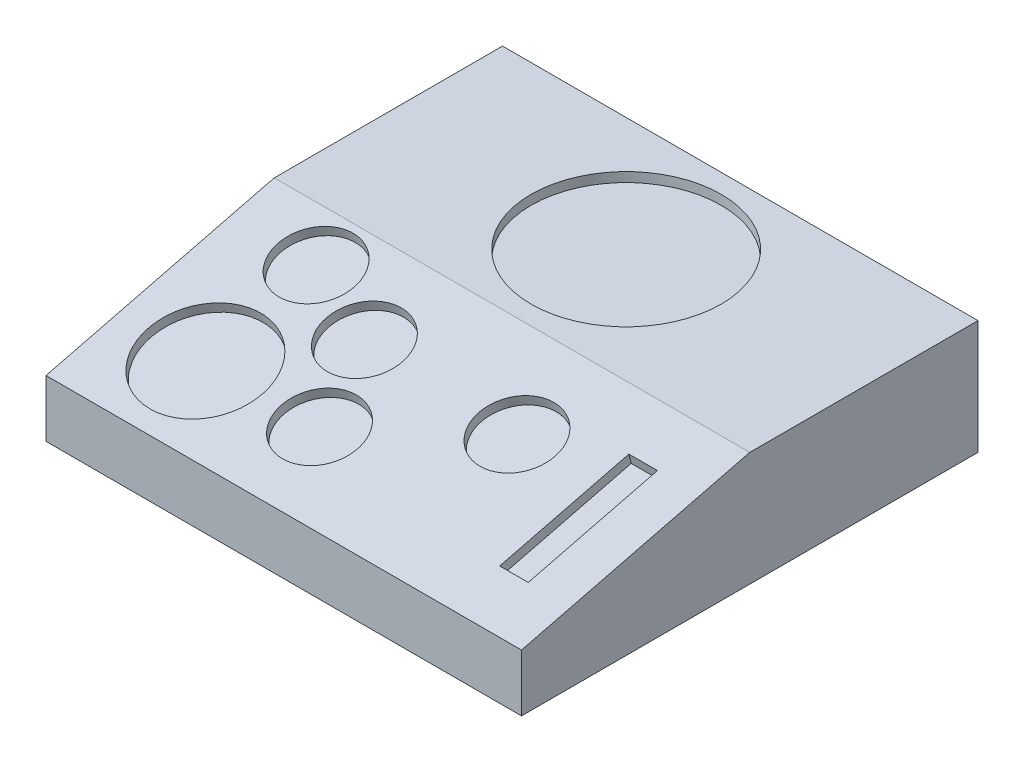
ISO-10303-21;
HEADER;
FILE_DESCRIPTION(('STEP AP214'),'2;1');
FILE_NAME('part.step','',(''),(''),'','','');
FILE_SCHEMA(('AUTOMOTIVE_DESIGN { 1 0 10303 214 1 1 1 1 }'));
ENDSEC;
DATA;
#1=APPLICATION_CONTEXT('core data for automotive mechanical design processes');
#2=APPLICATION_PROTOCOL_DEFINITION('international standard','automotive_design',2000,#1);
#3=PRODUCT_CONTEXT('',#1,'mechanical');
#4=PRODUCT('Part','Part','',(#3));
#5=PRODUCT_RELATED_PRODUCT_CATEGORY('part','',(#4));
#6=PRODUCT_DEFINITION_FORMATION('','',#4);
#7=PRODUCT_DEFINITION_CONTEXT('part definition',#1,'design');
#8=PRODUCT_DEFINITION('design','',#6,#7);
#9=PRODUCT_DEFINITION_SHAPE('','',#8);
#10=(LENGTH_UNIT() NAMED_UNIT(*) SI_UNIT(.MILLI.,.METRE.));
#11=(NAMED_UNIT(*) PLANE_ANGLE_UNIT() SI_UNIT($,.RADIAN.));
#12=(NAMED_UNIT(*) SI_UNIT($,.STERADIAN.) SOLID_ANGLE_UNIT());
#13=UNCERTAINTY_MEASURE_WITH_UNIT(LENGTH_MEASURE(1.E-05),#10,'distance_accuracy_value','');
#14=(GEOMETRIC_REPRESENTATION_CONTEXT(3) GLOBAL_UNCERTAINTY_ASSIGNED_CONTEXT((#13)) GLOBAL_UNIT_ASSIGNED_CONTEXT((#10,
#11,#12)) REPRESENTATION_CONTEXT('',''));
#15=CARTESIAN_POINT('',(0.,0.,0.));
#16=DIRECTION('',(0.,0.,1.));
#17=DIRECTION('',(1.,0.,0.));
#18=AXIS2_PLACEMENT_3D('',#15,#16,#17);
#19=CARTESIAN_POINT('',(125.,60.,60.));
#20=DIRECTION('',(-1.,0.,0.));
#21=DIRECTION('',(0.,0.,1.));
#22=AXIS2_PLACEMENT_3D('',#19,#20,#21);
#23=PLANE('',#22);
#24=DIRECTION('',(0.,0.,-1.));
#25=VECTOR('',#24,1.);
#26=CARTESIAN_POINT('',(125.,0.,60.));
#27=LINE('',#26,#25);
#28=CARTESIAN_POINT('',(125.,0.,180.));
#29=VERTEX_POINT('',#28);
#30=CARTESIAN_POINT('',(125.,0.,-60.));
#31=VERTEX_POINT('',#30);
#32=EDGE_CURVE('E190',#29,#31,#27,.T.);
#33=ORIENTED_EDGE('',*,*,#32,.T.);
#34=DIRECTION('',(0.,-1.,0.));
#35=VECTOR('',#34,1.);
#36=CARTESIAN_POINT('',(125.,60.,-60.));
#37=LINE('',#36,#35);
#38=CARTESIAN_POINT('',(125.,60.,-60.));
#39=VERTEX_POINT('',#38);
#40=EDGE_CURVE('E11',#39,#31,#37,.T.);
#41=ORIENTED_EDGE('',*,*,#40,.F.);
#42=DIRECTION('',(0.,0.,-1.));
#43=VECTOR('',#42,1.);
#44=CARTESIAN_POINT('',(125.,60.,60.));
#45=LINE('',#44,#43);
#46=CARTESIAN_POINT('',(125.,60.,60.));
#47=VERTEX_POINT('',#46);
#48=EDGE_CURVE('E200',#47,#39,#45,.T.);
#49=ORIENTED_EDGE('',*,*,#48,.F.);
#50=DIRECTION('',(0.,-0.242535625036333,0.970142500145332));
#51=VECTOR('',#50,1.);
#52=CARTESIAN_POINT('',(125.,30.,180.));
#53=LINE('',#52,#51);
#54=CARTESIAN_POINT('',(125.,30.,180.));
#55=VERTEX_POINT('',#54);
#56=EDGE_CURVE('E187',#47,#55,#53,.T.);
#57=ORIENTED_EDGE('',*,*,#56,.T.);
#58=DIRECTION('',(0.,-1.,0.));
#59=VECTOR('',#58,1.);
#60=CARTESIAN_POINT('',(125.,0.,180.));
#61=LINE('',#60,#59);
#62=EDGE_CURVE('E184',#55,#29,#61,.T.);
#63=ORIENTED_EDGE('',*,*,#62,.T.);
#64=EDGE_LOOP('',(#33,#41,#49,#57,#63));
#65=FACE_BOUND('',#64,.T.);
#66=ADVANCED_FACE('F33',(#65),#23,.F.);
#67=CARTESIAN_POINT('',(-125.,60.,-60.));
#68=DIRECTION('',(0.,0.,1.));
#69=DIRECTION('',(1.,0.,0.));
#70=AXIS2_PLACEMENT_3D('',#67,#68,#69);
#71=PLANE('',#70);
#72=DIRECTION('',(-1.,0.,0.));
#73=VECTOR('',#72,1.);
#74=CARTESIAN_POINT('',(-125.,0.,-60.));
#75=LINE('',#74,#73);
#76=CARTESIAN_POINT('',(-125.,0.,-60.));
#77=VERTEX_POINT('',#76);
#78=EDGE_CURVE('E70',#31,#77,#75,.T.);
#79=ORIENTED_EDGE('',*,*,#78,.T.);
#80=DIRECTION('',(0.,-1.,0.));
#81=VECTOR('',#80,1.);
#82=CARTESIAN_POINT('',(-125.,60.,-60.));
#83=LINE('',#82,#81);
#84=CARTESIAN_POINT('',(-125.,60.,-60.));
#85=VERTEX_POINT('',#84);
#86=EDGE_CURVE('E40',#85,#77,#83,.T.);
#87=ORIENTED_EDGE('',*,*,#86,.F.);
#88=DIRECTION('',(-1.,0.,0.));
#89=VECTOR('',#88,1.);
#90=CARTESIAN_POINT('',(-125.,60.,-60.));
#91=LINE('',#90,#89);
#92=EDGE_CURVE('E75',#39,#85,#91,.T.);
#93=ORIENTED_EDGE('',*,*,#92,.F.);
#94=ORIENTED_EDGE('',*,*,#40,.T.);
#95=EDGE_LOOP('',(#79,#87,#93,#94));
#96=FACE_BOUND('',#95,.T.);
#97=ADVANCED_FACE('F237',(#96),#71,.F.);
#98=CARTESIAN_POINT('',(-125.,60.,60.));
#99=DIRECTION('',(1.,0.,0.));
#100=DIRECTION('',(0.,0.,-1.));
#101=AXIS2_PLACEMENT_3D('',#98,#99,#100);
#102=PLANE('',#101);
#103=DIRECTION('',(0.,0.,1.));
#104=VECTOR('',#103,1.);
#105=CARTESIAN_POINT('',(-125.,0.,60.));
#106=LINE('',#105,#104);
#107=CARTESIAN_POINT('',(-125.,0.,180.));
#108=VERTEX_POINT('',#107);
#109=EDGE_CURVE('E202',#77,#108,#106,.T.);
#110=ORIENTED_EDGE('',*,*,#109,.T.);
#111=DIRECTION('',(0.,1.,0.));
#112=VECTOR('',#111,1.);
#113=CARTESIAN_POINT('',(-125.,0.,180.));
#114=LINE('',#113,#112);
#115=CARTESIAN_POINT('',(-125.,30.,180.));
#116=VERTEX_POINT('',#115);
#117=EDGE_CURVE('E193',#108,#116,#114,.T.);
#118=ORIENTED_EDGE('',*,*,#117,.T.);
#119=DIRECTION('',(0.,0.242535625036333,-0.970142500145332));
#120=VECTOR('',#119,1.);
#121=CARTESIAN_POINT('',(-125.,30.,180.));
#122=LINE('',#121,#120);
#123=CARTESIAN_POINT('',(-125.,60.,60.));
#124=VERTEX_POINT('',#123);
#125=EDGE_CURVE('E181',#116,#124,#122,.T.);
#126=ORIENTED_EDGE('',*,*,#125,.T.);
#127=DIRECTION('',(0.,0.,1.));
#128=VECTOR('',#127,1.);
#129=CARTESIAN_POINT('',(-125.,60.,60.));
#130=LINE('',#129,#128);
#131=EDGE_CURVE('E204',#85,#124,#130,.T.);
#132=ORIENTED_EDGE('',*,*,#131,.F.);
#133=ORIENTED_EDGE('',*,*,#86,.T.);
#134=EDGE_LOOP('',(#110,#118,#126,#132,#133));
#135=FACE_BOUND('',#134,.T.);
#136=ADVANCED_FACE('F213',(#135),#102,.F.);
#137=CARTESIAN_POINT('',(125.,60.,-60.));
#138=DIRECTION('',(0.,-1.,0.));
#139=DIRECTION('',(0.,0.,-1.));
#140=AXIS2_PLACEMENT_3D('',#137,#138,#139);
#141=PLANE('',#140);
#142=CARTESIAN_POINT('',(0.,60.,0.));
#143=DIRECTION('',(0.,1.,0.));
#144=DIRECTION('',(0.,0.,1.));
#145=AXIS2_PLACEMENT_3D('',#142,#143,#144);
#146=CIRCLE('',#145,50.);
#147=CARTESIAN_POINT('',(0.,60.,50.));
#148=VERTEX_POINT('',#147);
#149=EDGE_CURVE('E175',#148,#148,#146,.T.);
#150=ORIENTED_EDGE('',*,*,#149,.F.);
#151=EDGE_LOOP('',(#150));
#152=FACE_BOUND('',#151,.T.);
#153=ORIENTED_EDGE('',*,*,#48,.T.);
#154=ORIENTED_EDGE('',*,*,#92,.T.);
#155=ORIENTED_EDGE('',*,*,#131,.T.);
#156=DIRECTION('',(1.,0.,0.));
#157=VECTOR('',#156,1.);
#158=CARTESIAN_POINT('',(-125.,60.,60.));
#159=LINE('',#158,#157);
#160=EDGE_CURVE('E56',#124,#47,#159,.T.);
#161=ORIENTED_EDGE('',*,*,#160,.T.);
#162=EDGE_LOOP('',(#153,#154,#155,#161));
#163=FACE_BOUND('',#162,.T.);
#164=ADVANCED_FACE('F228',(#152,#163),#141,.F.);
#165=CARTESIAN_POINT('',(125.,0.,-60.));
#166=DIRECTION('',(0.,-1.,0.));
#167=DIRECTION('',(0.,0.,-1.));
#168=AXIS2_PLACEMENT_3D('',#165,#166,#167);
#169=PLANE('',#168);
#170=ORIENTED_EDGE('',*,*,#32,.F.);
#171=DIRECTION('',(-1.,0.,0.));
#172=VECTOR('',#171,1.);
#173=CARTESIAN_POINT('',(259.164078649987,0.,180.));
#174=LINE('',#173,#172);
#175=EDGE_CURVE('E196',#29,#108,#174,.T.);
#176=ORIENTED_EDGE('',*,*,#175,.T.);
#177=ORIENTED_EDGE('',*,*,#109,.F.);
#178=ORIENTED_EDGE('',*,*,#78,.F.);
#179=EDGE_LOOP('',(#170,#176,#177,#178));
#180=FACE_BOUND('',#179,.T.);
#181=ADVANCED_FACE('F215',(#180),#169,.T.);
#182=CARTESIAN_POINT('',(259.164078649987,30.,180.));
#183=DIRECTION('',(0.,0.970142500145332,0.242535625036333));
#184=DIRECTION('',(0.,-0.242535625036333,0.970142500145332));
#185=AXIS2_PLACEMENT_3D('',#182,#183,#184);
#186=PLANE('',#185);
#187=DIRECTION('',(0.,-0.242535625036333,0.970142500145332));
#188=VECTOR('',#187,1.);
#189=CARTESIAN_POINT('',(87.5,53.4887468762717,86.0450124949134));
#190=LINE('',#189,#188);
#191=CARTESIAN_POINT('',(87.5,53.4887468762717,86.0450124949134));
#192=VERTEX_POINT('',#191);
#193=CARTESIAN_POINT('',(87.5,36.5112531237283,153.954987505087));
#194=VERTEX_POINT('',#193);
#195=EDGE_CURVE('E47',#192,#194,#190,.T.);
#196=ORIENTED_EDGE('',*,*,#195,.F.);
#197=DIRECTION('',(-1.,0.,0.));
#198=VECTOR('',#197,1.);
#199=CARTESIAN_POINT('',(102.5,53.4887468762717,86.0450124949134));
#200=LINE('',#199,#198);
#201=CARTESIAN_POINT('',(102.5,53.4887468762717,86.0450124949134));
#202=VERTEX_POINT('',#201);
#203=EDGE_CURVE('E129',#202,#192,#200,.T.);
#204=ORIENTED_EDGE('',*,*,#203,.F.);
#205=DIRECTION('',(0.,0.242535625036333,-0.970142500145332));
#206=VECTOR('',#205,1.);
#207=CARTESIAN_POINT('',(102.5,53.4887468762717,86.0450124949134));
#208=LINE('',#207,#206);
#209=CARTESIAN_POINT('',(102.5,36.5112531237284,153.954987505087));
#210=VERTEX_POINT('',#209);
#211=EDGE_CURVE('E132',#210,#202,#208,.T.);
#212=ORIENTED_EDGE('',*,*,#211,.F.);
#213=DIRECTION('',(1.,0.,0.));
#214=VECTOR('',#213,1.);
#215=CARTESIAN_POINT('',(102.5,36.5112531237284,153.954987505087));
#216=LINE('',#215,#214);
#217=EDGE_CURVE('E138',#194,#210,#216,.T.);
#218=ORIENTED_EDGE('',*,*,#217,.F.);
#219=EDGE_LOOP('',(#196,#204,#212,#218));
#220=FACE_BOUND('',#219,.T.);
#221=CARTESIAN_POINT('',(45.,49.4028500029067,102.388599988373));
#222=DIRECTION('',(0.,0.970142500145332,0.242535625036333));
#223=DIRECTION('',(0.,-0.242535625036333,0.970142500145332));
#224=AXIS2_PLACEMENT_3D('',#221,#222,#223);
#225=CIRCLE('',#224,20.);
#226=CARTESIAN_POINT('',(45.,44.55213750218,121.79144999128));
#227=VERTEX_POINT('',#226);
#228=EDGE_CURVE('E144',#227,#227,#225,.T.);
#229=ORIENTED_EDGE('',*,*,#228,.F.);
#230=EDGE_LOOP('',(#229));
#231=FACE_BOUND('',#230,.T.);
#232=CARTESIAN_POINT('',(-20.,39.7014250014533,141.194299994187));
#233=DIRECTION('',(0.,0.970142500145332,0.242535625036333));
#234=DIRECTION('',(0.,-0.242535625036333,0.970142500145332));
#235=AXIS2_PLACEMENT_3D('',#232,#233,#234);
#236=CIRCLE('',#235,20.);
#237=CARTESIAN_POINT('',(-20.,34.8507125007267,160.597149997093));
#238=VERTEX_POINT('',#237);
#239=EDGE_CURVE('E151',#238,#238,#236,.T.);
#240=ORIENTED_EDGE('',*,*,#239,.F.);
#241=EDGE_LOOP('',(#240));
#242=FACE_BOUND('',#241,.T.);
#243=CARTESIAN_POINT('',(-37.573593128807,49.9913401100038,100.034639559985));
#244=DIRECTION('',(0.,0.970142500145332,0.242535625036333));
#245=DIRECTION('',(0.,-0.242535625036333,0.970142500145332));
#246=AXIS2_PLACEMENT_3D('',#243,#244,#245);
#247=CIRCLE('',#246,20.);
#248=CARTESIAN_POINT('',(-37.573593128807,45.1406276092772,119.437489562891));
#249=VERTEX_POINT('',#248);
#250=EDGE_CURVE('E157',#249,#249,#247,.T.);
#251=ORIENTED_EDGE('',*,*,#250,.F.);
#252=EDGE_LOOP('',(#251));
#253=FACE_BOUND('',#252,.T.);
#254=CARTESIAN_POINT('',(-80.,54.2535625036333,82.9857499854668));
#255=DIRECTION('',(0.,0.970142500145332,0.242535625036333));
#256=DIRECTION('',(0.,-0.242535625036333,0.970142500145332));
#257=AXIS2_PLACEMENT_3D('',#254,#255,#256);
#258=CIRCLE('',#257,20.);
#259=CARTESIAN_POINT('',(-80.,49.4028500029067,102.388599988373));
#260=VERTEX_POINT('',#259);
#261=EDGE_CURVE('E163',#260,#260,#258,.T.);
#262=ORIENTED_EDGE('',*,*,#261,.F.);
#263=EDGE_LOOP('',(#262));
#264=FACE_BOUND('',#263,.T.);
#265=CARTESIAN_POINT('',(-80.,39.7014250014533,141.194299994187));
#266=DIRECTION('',(0.,0.970142500145332,0.242535625036333));
#267=DIRECTION('',(0.,-0.242535625036333,0.970142500145332));
#268=AXIS2_PLACEMENT_3D('',#265,#266,#267);
#269=CIRCLE('',#268,30.);
#270=CARTESIAN_POINT('',(-80.,32.4253562503633,170.298574998547));
#271=VERTEX_POINT('',#270);
#272=EDGE_CURVE('E169',#271,#271,#269,.T.);
#273=ORIENTED_EDGE('',*,*,#272,.F.);
#274=EDGE_LOOP('',(#273));
#275=FACE_BOUND('',#274,.T.);
#276=ORIENTED_EDGE('',*,*,#56,.F.);
#277=ORIENTED_EDGE('',*,*,#160,.F.);
#278=ORIENTED_EDGE('',*,*,#125,.F.);
#279=DIRECTION('',(-1.,0.,0.));
#280=VECTOR('',#279,1.);
#281=CARTESIAN_POINT('',(259.164078649987,30.,180.));
#282=LINE('',#281,#280);
#283=EDGE_CURVE('E188',#55,#116,#282,.T.);
#284=ORIENTED_EDGE('',*,*,#283,.F.);
#285=EDGE_LOOP('',(#276,#277,#278,#284));
#286=FACE_BOUND('',#285,.T.);
#287=ADVANCED_FACE('F225',(#220,#231,#242,#253,#264,#275,#286),#186,.T.);
#288=CARTESIAN_POINT('',(259.164078649987,0.,180.));
#289=DIRECTION('',(0.,0.,1.));
#290=DIRECTION('',(1.,0.,0.));
#291=AXIS2_PLACEMENT_3D('',#288,#289,#290);
#292=PLANE('',#291);
#293=ORIENTED_EDGE('',*,*,#62,.F.);
#294=ORIENTED_EDGE('',*,*,#283,.T.);
#295=ORIENTED_EDGE('',*,*,#117,.F.);
#296=ORIENTED_EDGE('',*,*,#175,.F.);
#297=EDGE_LOOP('',(#293,#294,#295,#296));
#298=FACE_BOUND('',#297,.T.);
#299=ADVANCED_FACE('F220',(#298),#292,.T.);
#300=CARTESIAN_POINT('',(0.,55.,0.));
#301=DIRECTION('',(0.,1.,0.));
#302=DIRECTION('',(0.,0.,1.));
#303=AXIS2_PLACEMENT_3D('',#300,#301,#302);
#304=CYLINDRICAL_SURFACE('',#303,50.);
#305=CARTESIAN_POINT('',(0.,55.,0.));
#306=DIRECTION('',(0.,1.,0.));
#307=DIRECTION('',(0.,0.,1.));
#308=AXIS2_PLACEMENT_3D('',#305,#306,#307);
#309=CIRCLE('',#308,50.);
#310=CARTESIAN_POINT('',(0.,55.,50.));
#311=VERTEX_POINT('',#310);
#312=EDGE_CURVE('E178',#311,#311,#309,.T.);
#313=ORIENTED_EDGE('',*,*,#312,.F.);
#314=EDGE_LOOP('',(#313));
#315=FACE_BOUND('',#314,.T.);
#316=ORIENTED_EDGE('',*,*,#149,.T.);
#317=EDGE_LOOP('',(#316));
#318=FACE_BOUND('',#317,.T.);
#319=ADVANCED_FACE('F271',(#315,#318),#304,.F.);
#320=CARTESIAN_POINT('',(0.,55.,0.));
#321=DIRECTION('',(0.,1.,0.));
#322=DIRECTION('',(0.,0.,1.));
#323=AXIS2_PLACEMENT_3D('',#320,#321,#322);
#324=PLANE('',#323);
#325=ORIENTED_EDGE('',*,*,#312,.T.);
#326=EDGE_LOOP('',(#325));
#327=FACE_BOUND('',#326,.T.);
#328=ADVANCED_FACE('F285',(#327),#324,.T.);
#329=CARTESIAN_POINT('',(-80.,34.8507125007267,139.981621869005));
#330=DIRECTION('',(0.,0.970142500145332,0.242535625036333));
#331=DIRECTION('',(0.,-0.242535625036333,0.970142500145332));
#332=AXIS2_PLACEMENT_3D('',#329,#330,#331);
#333=CYLINDRICAL_SURFACE('',#332,30.);
#334=CARTESIAN_POINT('',(-80.,34.8507125007267,139.981621869005));
#335=DIRECTION('',(0.,0.970142500145332,0.242535625036333));
#336=DIRECTION('',(0.,-0.242535625036333,0.970142500145332));
#337=AXIS2_PLACEMENT_3D('',#334,#335,#336);
#338=CIRCLE('',#337,30.);
#339=CARTESIAN_POINT('',(-80.,27.5746437496367,169.085896873365));
#340=VERTEX_POINT('',#339);
#341=EDGE_CURVE('E172',#340,#340,#338,.T.);
#342=ORIENTED_EDGE('',*,*,#341,.F.);
#343=EDGE_LOOP('',(#342));
#344=FACE_BOUND('',#343,.T.);
#345=ORIENTED_EDGE('',*,*,#272,.T.);
#346=EDGE_LOOP('',(#345));
#347=FACE_BOUND('',#346,.T.);
#348=ADVANCED_FACE('F295',(#344,#347),#333,.F.);
#349=CARTESIAN_POINT('',(-80.,34.8507125007267,139.981621869005));
#350=DIRECTION('',(0.,0.970142500145332,0.242535625036333));
#351=DIRECTION('',(0.,-0.242535625036333,0.970142500145332));
#352=AXIS2_PLACEMENT_3D('',#349,#350,#351);
#353=PLANE('',#352);
#354=ORIENTED_EDGE('',*,*,#341,.T.);
#355=EDGE_LOOP('',(#354));
#356=FACE_BOUND('',#355,.T.);
#357=ADVANCED_FACE('F311',(#356),#353,.T.);
#358=CARTESIAN_POINT('',(-80.,49.4028500029067,81.7730718602852));
#359=DIRECTION('',(0.,0.970142500145332,0.242535625036333));
#360=DIRECTION('',(0.,-0.242535625036333,0.970142500145332));
#361=AXIS2_PLACEMENT_3D('',#358,#359,#360);
#362=CYLINDRICAL_SURFACE('',#361,20.);
#363=CARTESIAN_POINT('',(-80.,49.4028500029067,81.7730718602852));
#364=DIRECTION('',(0.,0.970142500145332,0.242535625036333));
#365=DIRECTION('',(0.,-0.242535625036333,0.970142500145332));
#366=AXIS2_PLACEMENT_3D('',#363,#364,#365);
#367=CIRCLE('',#366,20.);
#368=CARTESIAN_POINT('',(-80.,44.55213750218,101.175921863192));
#369=VERTEX_POINT('',#368);
#370=EDGE_CURVE('E166',#369,#369,#367,.T.);
#371=ORIENTED_EDGE('',*,*,#370,.F.);
#372=EDGE_LOOP('',(#371));
#373=FACE_BOUND('',#372,.T.);
#374=ORIENTED_EDGE('',*,*,#261,.T.);
#375=EDGE_LOOP('',(#374));
#376=FACE_BOUND('',#375,.T.);
#377=ADVANCED_FACE('F321',(#373,#376),#362,.F.);
#378=CARTESIAN_POINT('',(-80.,49.4028500029067,81.7730718602852));
#379=DIRECTION('',(0.,0.970142500145332,0.242535625036333));
#380=DIRECTION('',(0.,-0.242535625036333,0.970142500145332));
#381=AXIS2_PLACEMENT_3D('',#378,#379,#380);
#382=PLANE('',#381);
#383=ORIENTED_EDGE('',*,*,#370,.T.);
#384=EDGE_LOOP('',(#383));
#385=FACE_BOUND('',#384,.T.);
#386=ADVANCED_FACE('F331',(#385),#382,.T.);
#387=CARTESIAN_POINT('',(-37.573593128807,45.1406276092772,98.8219614348032));
#388=DIRECTION('',(0.,0.970142500145332,0.242535625036333));
#389=DIRECTION('',(0.,-0.242535625036333,0.970142500145332));
#390=AXIS2_PLACEMENT_3D('',#387,#388,#389);
#391=CYLINDRICAL_SURFACE('',#390,20.);
#392=CARTESIAN_POINT('',(-37.573593128807,45.1406276092772,98.8219614348032));
#393=DIRECTION('',(0.,0.970142500145332,0.242535625036333));
#394=DIRECTION('',(0.,-0.242535625036333,0.970142500145332));
#395=AXIS2_PLACEMENT_3D('',#392,#393,#394);
#396=CIRCLE('',#395,20.);
#397=CARTESIAN_POINT('',(-37.573593128807,40.2899151085505,118.22481143771));
#398=VERTEX_POINT('',#397);
#399=EDGE_CURVE('E160',#398,#398,#396,.T.);
#400=ORIENTED_EDGE('',*,*,#399,.F.);
#401=EDGE_LOOP('',(#400));
#402=FACE_BOUND('',#401,.T.);
#403=ORIENTED_EDGE('',*,*,#250,.T.);
#404=EDGE_LOOP('',(#403));
#405=FACE_BOUND('',#404,.T.);
#406=ADVANCED_FACE('F341',(#402,#405),#391,.F.);
#407=CARTESIAN_POINT('',(-37.573593128807,45.1406276092772,98.8219614348032));
#408=DIRECTION('',(0.,0.970142500145332,0.242535625036333));
#409=DIRECTION('',(0.,-0.242535625036333,0.970142500145332));
#410=AXIS2_PLACEMENT_3D('',#407,#408,#409);
#411=PLANE('',#410);
#412=ORIENTED_EDGE('',*,*,#399,.T.);
#413=EDGE_LOOP('',(#412));
#414=FACE_BOUND('',#413,.T.);
#415=ADVANCED_FACE('F351',(#414),#411,.T.);
#416=CARTESIAN_POINT('',(-20.,34.8507125007267,139.981621869005));
#417=DIRECTION('',(0.,0.970142500145332,0.242535625036333));
#418=DIRECTION('',(0.,-0.242535625036333,0.970142500145332));
#419=AXIS2_PLACEMENT_3D('',#416,#417,#418);
#420=CYLINDRICAL_SURFACE('',#419,20.);
#421=CARTESIAN_POINT('',(-20.,34.8507125007267,139.981621869005));
#422=DIRECTION('',(0.,0.970142500145332,0.242535625036333));
#423=DIRECTION('',(0.,-0.242535625036333,0.970142500145332));
#424=AXIS2_PLACEMENT_3D('',#421,#422,#423);
#425=CIRCLE('',#424,20.);
#426=CARTESIAN_POINT('',(-20.,30.,159.384471871912));
#427=VERTEX_POINT('',#426);
#428=EDGE_CURVE('E154',#427,#427,#425,.T.);
#429=ORIENTED_EDGE('',*,*,#428,.F.);
#430=EDGE_LOOP('',(#429));
#431=FACE_BOUND('',#430,.T.);
#432=ORIENTED_EDGE('',*,*,#239,.T.);
#433=EDGE_LOOP('',(#432));
#434=FACE_BOUND('',#433,.T.);
#435=ADVANCED_FACE('F361',(#431,#434),#420,.F.);
#436=CARTESIAN_POINT('',(-20.,34.8507125007267,139.981621869005));
#437=DIRECTION('',(0.,0.970142500145332,0.242535625036333));
#438=DIRECTION('',(0.,-0.242535625036333,0.970142500145332));
#439=AXIS2_PLACEMENT_3D('',#436,#437,#438);
#440=PLANE('',#439);
#441=ORIENTED_EDGE('',*,*,#428,.T.);
#442=EDGE_LOOP('',(#441));
#443=FACE_BOUND('',#442,.T.);
#444=ADVANCED_FACE('F371',(#443),#440,.T.);
#445=CARTESIAN_POINT('',(45.,44.55213750218,101.175921863192));
#446=DIRECTION('',(0.,0.970142500145332,0.242535625036333));
#447=DIRECTION('',(0.,-0.242535625036333,0.970142500145332));
#448=AXIS2_PLACEMENT_3D('',#445,#446,#447);
#449=CYLINDRICAL_SURFACE('',#448,20.);
#450=CARTESIAN_POINT('',(45.,44.55213750218,101.175921863192));
#451=DIRECTION('',(0.,0.970142500145332,0.242535625036333));
#452=DIRECTION('',(0.,-0.242535625036333,0.970142500145332));
#453=AXIS2_PLACEMENT_3D('',#450,#451,#452);
#454=CIRCLE('',#453,20.);
#455=CARTESIAN_POINT('',(45.,39.7014250014533,120.578771866098));
#456=VERTEX_POINT('',#455);
#457=EDGE_CURVE('E148',#456,#456,#454,.T.);
#458=ORIENTED_EDGE('',*,*,#457,.F.);
#459=EDGE_LOOP('',(#458));
#460=FACE_BOUND('',#459,.T.);
#461=ORIENTED_EDGE('',*,*,#228,.T.);
#462=EDGE_LOOP('',(#461));
#463=FACE_BOUND('',#462,.T.);
#464=ADVANCED_FACE('F381',(#460,#463),#449,.F.);
#465=CARTESIAN_POINT('',(45.,44.55213750218,101.175921863192));
#466=DIRECTION('',(0.,0.970142500145332,0.242535625036333));
#467=DIRECTION('',(0.,-0.242535625036333,0.970142500145332));
#468=AXIS2_PLACEMENT_3D('',#465,#466,#467);
#469=PLANE('',#468);
#470=ORIENTED_EDGE('',*,*,#457,.T.);
#471=EDGE_LOOP('',(#470));
#472=FACE_BOUND('',#471,.T.);
#473=ADVANCED_FACE('F391',(#472),#469,.T.);
#474=CARTESIAN_POINT('',(87.5,48.638034375545,84.8323343697317));
#475=DIRECTION('',(-1.,0.,0.));
#476=DIRECTION('',(0.,0.,1.));
#477=AXIS2_PLACEMENT_3D('',#474,#475,#476);
#478=PLANE('',#477);
#479=ORIENTED_EDGE('',*,*,#195,.T.);
#480=DIRECTION('',(0.,0.970142500145332,0.242535625036333));
#481=VECTOR('',#480,1.);
#482=CARTESIAN_POINT('',(87.5,31.6605406230017,152.742309379905));
#483=LINE('',#482,#481);
#484=CARTESIAN_POINT('',(87.5,31.6605406230017,152.742309379905));
#485=VERTEX_POINT('',#484);
#486=EDGE_CURVE('E107',#485,#194,#483,.T.);
#487=ORIENTED_EDGE('',*,*,#486,.F.);
#488=DIRECTION('',(0.,-0.242535625036333,0.970142500145332));
#489=VECTOR('',#488,1.);
#490=CARTESIAN_POINT('',(87.5,48.638034375545,84.8323343697317));
#491=LINE('',#490,#489);
#492=CARTESIAN_POINT('',(87.5,48.638034375545,84.8323343697317));
#493=VERTEX_POINT('',#492);
#494=EDGE_CURVE('E111',#493,#485,#491,.T.);
#495=ORIENTED_EDGE('',*,*,#494,.F.);
#496=DIRECTION('',(0.,0.970142500145332,0.242535625036333));
#497=VECTOR('',#496,1.);
#498=CARTESIAN_POINT('',(87.5,48.638034375545,84.8323343697317));
#499=LINE('',#498,#497);
#500=EDGE_CURVE('E142',#493,#192,#499,.T.);
#501=ORIENTED_EDGE('',*,*,#500,.T.);
#502=EDGE_LOOP('',(#479,#487,#495,#501));
#503=FACE_BOUND('',#502,.T.);
#504=ADVANCED_FACE('F109',(#503),#478,.F.);
#505=CARTESIAN_POINT('',(102.5,48.638034375545,84.8323343697317));
#506=DIRECTION('',(0.,0.242535625036333,-0.970142500145332));
#507=DIRECTION('',(0.,0.970142500145332,0.242535625036333));
#508=AXIS2_PLACEMENT_3D('',#505,#506,#507);
#509=PLANE('',#508);
#510=ORIENTED_EDGE('',*,*,#203,.T.);
#511=ORIENTED_EDGE('',*,*,#500,.F.);
#512=DIRECTION('',(-1.,0.,0.));
#513=VECTOR('',#512,1.);
#514=CARTESIAN_POINT('',(102.5,48.638034375545,84.8323343697317));
#515=LINE('',#514,#513);
#516=CARTESIAN_POINT('',(102.5,48.638034375545,84.8323343697317));
#517=VERTEX_POINT('',#516);
#518=EDGE_CURVE('E117',#517,#493,#515,.T.);
#519=ORIENTED_EDGE('',*,*,#518,.F.);
#520=DIRECTION('',(0.,0.970142500145332,0.242535625036333));
#521=VECTOR('',#520,1.);
#522=CARTESIAN_POINT('',(102.5,48.638034375545,84.8323343697317));
#523=LINE('',#522,#521);
#524=EDGE_CURVE('E145',#517,#202,#523,.T.);
#525=ORIENTED_EDGE('',*,*,#524,.T.);
#526=EDGE_LOOP('',(#510,#511,#519,#525));
#527=FACE_BOUND('',#526,.T.);
#528=ADVANCED_FACE('F410',(#527),#509,.F.);
#529=CARTESIAN_POINT('',(102.5,48.638034375545,84.8323343697317));
#530=DIRECTION('',(1.,0.,0.));
#531=DIRECTION('',(0.,0.,-1.));
#532=AXIS2_PLACEMENT_3D('',#529,#530,#531);
#533=PLANE('',#532);
#534=ORIENTED_EDGE('',*,*,#211,.T.);
#535=ORIENTED_EDGE('',*,*,#524,.F.);
#536=DIRECTION('',(0.,0.242535625036333,-0.970142500145332));
#537=VECTOR('',#536,1.);
#538=CARTESIAN_POINT('',(102.5,48.638034375545,84.8323343697317));
#539=LINE('',#538,#537);
#540=CARTESIAN_POINT('',(102.5,31.6605406230017,152.742309379905));
#541=VERTEX_POINT('',#540);
#542=EDGE_CURVE('E125',#541,#517,#539,.T.);
#543=ORIENTED_EDGE('',*,*,#542,.F.);
#544=DIRECTION('',(0.,0.970142500145332,0.242535625036333));
#545=VECTOR('',#544,1.);
#546=CARTESIAN_POINT('',(102.5,31.6605406230017,152.742309379905));
#547=LINE('',#546,#545);
#548=EDGE_CURVE('E116',#541,#210,#547,.T.);
#549=ORIENTED_EDGE('',*,*,#548,.T.);
#550=EDGE_LOOP('',(#534,#535,#543,#549));
#551=FACE_BOUND('',#550,.T.);
#552=ADVANCED_FACE('F419',(#551),#533,.F.);
#553=CARTESIAN_POINT('',(102.5,31.6605406230017,152.742309379905));
#554=DIRECTION('',(0.,-0.242535625036333,0.970142500145332));
#555=DIRECTION('',(0.,-0.970142500145332,-0.242535625036333));
#556=AXIS2_PLACEMENT_3D('',#553,#554,#555);
#557=PLANE('',#556);
#558=ORIENTED_EDGE('',*,*,#217,.T.);
#559=ORIENTED_EDGE('',*,*,#548,.F.);
#560=DIRECTION('',(1.,0.,0.));
#561=VECTOR('',#560,1.);
#562=CARTESIAN_POINT('',(102.5,31.6605406230017,152.742309379905));
#563=LINE('',#562,#561);
#564=EDGE_CURVE('E120',#485,#541,#563,.T.);
#565=ORIENTED_EDGE('',*,*,#564,.F.);
#566=ORIENTED_EDGE('',*,*,#486,.T.);
#567=EDGE_LOOP('',(#558,#559,#565,#566));
#568=FACE_BOUND('',#567,.T.);
#569=ADVANCED_FACE('F121',(#568),#557,.F.);
#570=CARTESIAN_POINT('',(87.5,31.6605406230017,152.742309379905));
#571=DIRECTION('',(0.,-0.970142500145332,-0.242535625036333));
#572=DIRECTION('',(0.,0.242535625036333,-0.970142500145332));
#573=AXIS2_PLACEMENT_3D('',#570,#571,#572);
#574=PLANE('',#573);
#575=ORIENTED_EDGE('',*,*,#494,.T.);
#576=ORIENTED_EDGE('',*,*,#564,.T.);
#577=ORIENTED_EDGE('',*,*,#542,.T.);
#578=ORIENTED_EDGE('',*,*,#518,.T.);
#579=EDGE_LOOP('',(#575,#576,#577,#578));
#580=FACE_BOUND('',#579,.T.);
#581=ADVANCED_FACE('F127',(#580),#574,.F.);
#582=CLOSED_SHELL('',(#66,#97,#136,#164,#181,#287,#299,#319,#328,#348,#357,#377,#386,#406,#415,
#435,#444,#464,#473,#504,#528,#552,#569,#581));
#583=MANIFOLD_SOLID_BREP('B2',#582);
#584=ADVANCED_BREP_SHAPE_REPRESENTATION('',(#18,#583),#14);
#585=SHAPE_DEFINITION_REPRESENTATION(#9,#584);
ENDSEC;
END-ISO-10303-21;
